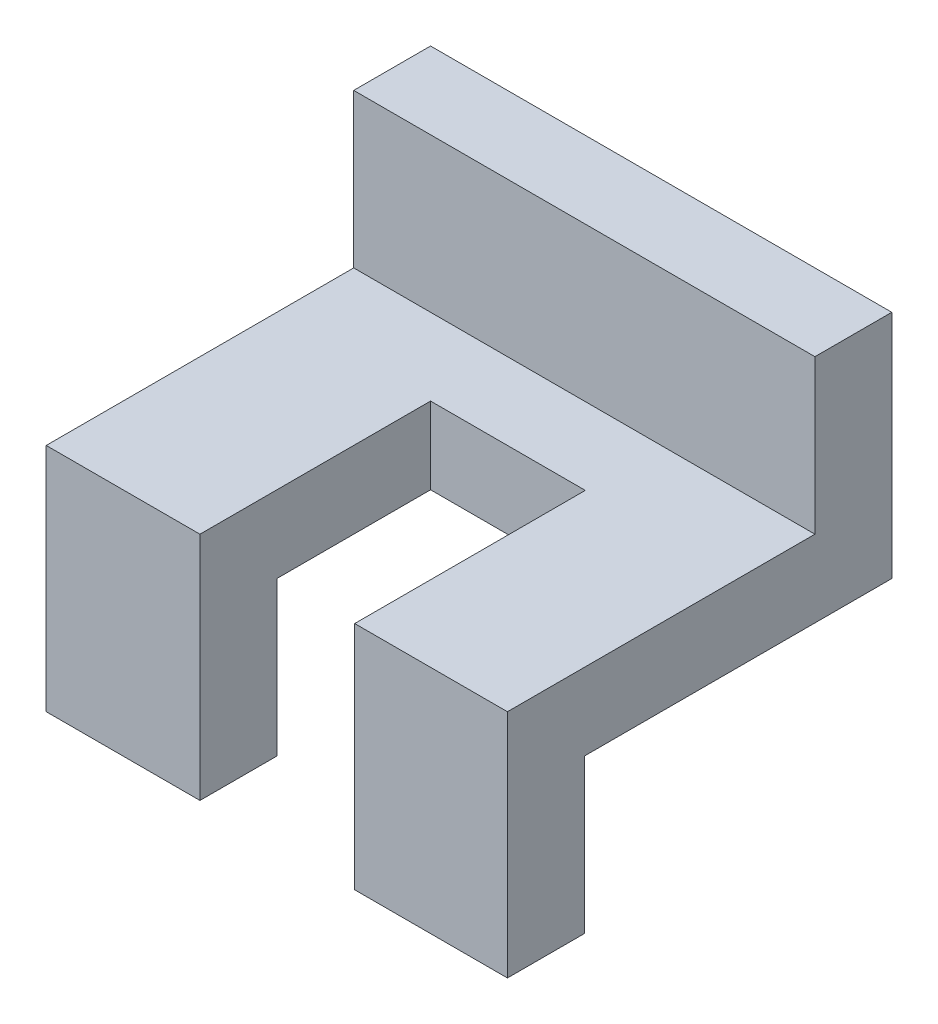
ISO-10303-21;
HEADER;
FILE_DESCRIPTION(('STEP AP214'),'2;1');
FILE_NAME('part.step','',(''),(''),'','','');
FILE_SCHEMA(('AUTOMOTIVE_DESIGN { 1 0 10303 214 1 1 1 1 }'));
ENDSEC;
DATA;
#1=APPLICATION_CONTEXT('core data for automotive mechanical design processes');
#2=APPLICATION_PROTOCOL_DEFINITION('international standard','automotive_design',2000,#1);
#3=PRODUCT_CONTEXT('',#1,'mechanical');
#4=PRODUCT('Part','Part','',(#3));
#5=PRODUCT_RELATED_PRODUCT_CATEGORY('part','',(#4));
#6=PRODUCT_DEFINITION_FORMATION('','',#4);
#7=PRODUCT_DEFINITION_CONTEXT('part definition',#1,'design');
#8=PRODUCT_DEFINITION('design','',#6,#7);
#9=PRODUCT_DEFINITION_SHAPE('','',#8);
#10=(LENGTH_UNIT() NAMED_UNIT(*) SI_UNIT(.MILLI.,.METRE.));
#11=(NAMED_UNIT(*) PLANE_ANGLE_UNIT() SI_UNIT($,.RADIAN.));
#12=(NAMED_UNIT(*) SI_UNIT($,.STERADIAN.) SOLID_ANGLE_UNIT());
#13=UNCERTAINTY_MEASURE_WITH_UNIT(LENGTH_MEASURE(1.E-05),#10,'distance_accuracy_value','');
#14=(GEOMETRIC_REPRESENTATION_CONTEXT(3) GLOBAL_UNCERTAINTY_ASSIGNED_CONTEXT((#13)) GLOBAL_UNIT_ASSIGNED_CONTEXT((#10,
#11,#12)) REPRESENTATION_CONTEXT('',''));
#15=CARTESIAN_POINT('',(0.,0.,0.));
#16=DIRECTION('',(0.,0.,1.));
#17=DIRECTION('',(1.,0.,0.));
#18=AXIS2_PLACEMENT_3D('',#15,#16,#17);
#19=CARTESIAN_POINT('',(38.1,3.175,15.875));
#20=DIRECTION('',(0.,0.,-1.));
#21=DIRECTION('',(0.,1.,0.));
#22=AXIS2_PLACEMENT_3D('',#19,#20,#21);
#23=PLANE('',#22);
#24=DIRECTION('',(-1.,0.,0.));
#25=VECTOR('',#24,1.);
#26=CARTESIAN_POINT('',(38.1,-15.875,15.875));
#27=LINE('',#26,#25);
#28=CARTESIAN_POINT('',(12.7,-15.875,15.875));
#29=VERTEX_POINT('',#28);
#30=CARTESIAN_POINT('',(0.,-15.875,15.875));
#31=VERTEX_POINT('',#30);
#32=EDGE_CURVE('E172',#29,#31,#27,.T.);
#33=ORIENTED_EDGE('',*,*,#32,.F.);
#34=DIRECTION('',(0.,1.,0.));
#35=VECTOR('',#34,1.);
#36=CARTESIAN_POINT('',(12.7,-15.875,15.875));
#37=LINE('',#36,#35);
#38=CARTESIAN_POINT('',(12.7,3.175,15.875));
#39=VERTEX_POINT('',#38);
#40=EDGE_CURVE('E214',#29,#39,#37,.T.);
#41=ORIENTED_EDGE('',*,*,#40,.T.);
#42=DIRECTION('',(-1.,0.,0.));
#43=VECTOR('',#42,1.);
#44=CARTESIAN_POINT('',(38.1,3.175,15.875));
#45=LINE('',#44,#43);
#46=CARTESIAN_POINT('',(0.,3.175,15.875));
#47=VERTEX_POINT('',#46);
#48=EDGE_CURVE('E176',#39,#47,#45,.T.);
#49=ORIENTED_EDGE('',*,*,#48,.T.);
#50=DIRECTION('',(0.,-1.,0.));
#51=VECTOR('',#50,1.);
#52=CARTESIAN_POINT('',(0.,3.175,15.875));
#53=LINE('',#52,#51);
#54=EDGE_CURVE('E150',#47,#31,#53,.T.);
#55=ORIENTED_EDGE('',*,*,#54,.T.);
#56=EDGE_LOOP('',(#33,#41,#49,#55));
#57=FACE_BOUND('',#56,.T.);
#58=ADVANCED_FACE('F33',(#57),#23,.F.);
#59=CARTESIAN_POINT('',(38.1,-15.875,15.875));
#60=DIRECTION('',(0.,1.,0.));
#61=DIRECTION('',(0.,0.,1.));
#62=AXIS2_PLACEMENT_3D('',#59,#60,#61);
#63=PLANE('',#62);
#64=DIRECTION('',(-1.,0.,0.));
#65=VECTOR('',#64,1.);
#66=CARTESIAN_POINT('',(38.1,-15.875,9.525));
#67=LINE('',#66,#65);
#68=CARTESIAN_POINT('',(12.7,-15.875,9.525));
#69=VERTEX_POINT('',#68);
#70=CARTESIAN_POINT('',(0.,-15.875,9.525));
#71=VERTEX_POINT('',#70);
#72=EDGE_CURVE('E168',#69,#71,#67,.T.);
#73=ORIENTED_EDGE('',*,*,#72,.F.);
#74=DIRECTION('',(0.,0.,1.));
#75=VECTOR('',#74,1.);
#76=CARTESIAN_POINT('',(12.7,-15.875,15.875));
#77=LINE('',#76,#75);
#78=EDGE_CURVE('E245',#69,#29,#77,.T.);
#79=ORIENTED_EDGE('',*,*,#78,.T.);
#80=ORIENTED_EDGE('',*,*,#32,.T.);
#81=DIRECTION('',(0.,0.,-1.));
#82=VECTOR('',#81,1.);
#83=CARTESIAN_POINT('',(0.,-15.875,15.875));
#84=LINE('',#83,#82);
#85=EDGE_CURVE('E153',#31,#71,#84,.T.);
#86=ORIENTED_EDGE('',*,*,#85,.T.);
#87=EDGE_LOOP('',(#73,#79,#80,#86));
#88=FACE_BOUND('',#87,.T.);
#89=ADVANCED_FACE('F251',(#88),#63,.F.);
#90=CARTESIAN_POINT('',(38.1,-3.175,9.525));
#91=DIRECTION('',(0.,0.,1.));
#92=DIRECTION('',(0.,-1.,0.));
#93=AXIS2_PLACEMENT_3D('',#90,#91,#92);
#94=PLANE('',#93);
#95=DIRECTION('',(-1.,0.,0.));
#96=VECTOR('',#95,1.);
#97=CARTESIAN_POINT('',(38.1,-3.175,9.525));
#98=LINE('',#97,#96);
#99=CARTESIAN_POINT('',(12.7,-3.175,9.525));
#100=VERTEX_POINT('',#99);
#101=CARTESIAN_POINT('',(0.,-3.175,9.525));
#102=VERTEX_POINT('',#101);
#103=EDGE_CURVE('E134',#100,#102,#98,.T.);
#104=ORIENTED_EDGE('',*,*,#103,.F.);
#105=DIRECTION('',(0.,-1.,0.));
#106=VECTOR('',#105,1.);
#107=CARTESIAN_POINT('',(12.7,-3.175,9.525));
#108=LINE('',#107,#106);
#109=EDGE_CURVE('E147',#100,#69,#108,.T.);
#110=ORIENTED_EDGE('',*,*,#109,.T.);
#111=ORIENTED_EDGE('',*,*,#72,.T.);
#112=DIRECTION('',(0.,1.,0.));
#113=VECTOR('',#112,1.);
#114=CARTESIAN_POINT('',(0.,-3.175,9.525));
#115=LINE('',#114,#113);
#116=EDGE_CURVE('E156',#71,#102,#115,.T.);
#117=ORIENTED_EDGE('',*,*,#116,.T.);
#118=EDGE_LOOP('',(#104,#110,#111,#117));
#119=FACE_BOUND('',#118,.T.);
#120=ADVANCED_FACE('F249',(#119),#94,.F.);
#121=CARTESIAN_POINT('',(38.1,3.175,-9.525));
#122=DIRECTION('',(0.,0.,-1.));
#123=DIRECTION('',(-1.,0.,0.));
#124=AXIS2_PLACEMENT_3D('',#121,#122,#123);
#125=PLANE('',#124);
#126=DIRECTION('',(0.,-1.,0.));
#127=VECTOR('',#126,1.);
#128=CARTESIAN_POINT('',(0.,3.175,-9.525));
#129=LINE('',#128,#127);
#130=CARTESIAN_POINT('',(0.,15.875,-9.525));
#131=VERTEX_POINT('',#130);
#132=CARTESIAN_POINT('',(0.,3.175,-9.525));
#133=VERTEX_POINT('',#132);
#134=EDGE_CURVE('E143',#131,#133,#129,.T.);
#135=ORIENTED_EDGE('',*,*,#134,.T.);
#136=DIRECTION('',(-1.,0.,0.));
#137=VECTOR('',#136,1.);
#138=CARTESIAN_POINT('',(38.1,3.175,-9.525));
#139=LINE('',#138,#137);
#140=CARTESIAN_POINT('',(38.1,3.175,-9.525));
#141=VERTEX_POINT('',#140);
#142=EDGE_CURVE('E180',#141,#133,#139,.T.);
#143=ORIENTED_EDGE('',*,*,#142,.F.);
#144=DIRECTION('',(0.,-1.,0.));
#145=VECTOR('',#144,1.);
#146=CARTESIAN_POINT('',(38.1,3.175,-9.525));
#147=LINE('',#146,#145);
#148=CARTESIAN_POINT('',(38.1,15.875,-9.525));
#149=VERTEX_POINT('',#148);
#150=EDGE_CURVE('E163',#149,#141,#147,.T.);
#151=ORIENTED_EDGE('',*,*,#150,.F.);
#152=DIRECTION('',(-1.,0.,0.));
#153=VECTOR('',#152,1.);
#154=CARTESIAN_POINT('',(38.1,15.875,-9.525));
#155=LINE('',#154,#153);
#156=EDGE_CURVE('E139',#149,#131,#155,.T.);
#157=ORIENTED_EDGE('',*,*,#156,.T.);
#158=EDGE_LOOP('',(#135,#143,#151,#157));
#159=FACE_BOUND('',#158,.T.);
#160=ADVANCED_FACE('F35',(#159),#125,.F.);
#161=CARTESIAN_POINT('',(38.1,3.175,15.875));
#162=DIRECTION('',(0.,-1.,0.));
#163=DIRECTION('',(0.,0.,-1.));
#164=AXIS2_PLACEMENT_3D('',#161,#162,#163);
#165=PLANE('',#164);
#166=ORIENTED_EDGE('',*,*,#48,.F.);
#167=DIRECTION('',(0.,0.,1.));
#168=VECTOR('',#167,1.);
#169=CARTESIAN_POINT('',(12.7,3.175,15.875));
#170=LINE('',#169,#168);
#171=CARTESIAN_POINT('',(12.7,3.175,-3.175));
#172=VERTEX_POINT('',#171);
#173=EDGE_CURVE('E279',#172,#39,#170,.T.);
#174=ORIENTED_EDGE('',*,*,#173,.F.);
#175=DIRECTION('',(-1.,0.,0.));
#176=VECTOR('',#175,1.);
#177=CARTESIAN_POINT('',(12.7,3.175,-3.175));
#178=LINE('',#177,#176);
#179=CARTESIAN_POINT('',(25.4826899387569,3.175,-3.175));
#180=VERTEX_POINT('',#179);
#181=EDGE_CURVE('E199',#180,#172,#178,.T.);
#182=ORIENTED_EDGE('',*,*,#181,.F.);
#183=DIRECTION('',(0.,0.,-1.));
#184=VECTOR('',#183,1.);
#185=CARTESIAN_POINT('',(25.4826899387569,3.175,15.875));
#186=LINE('',#185,#184);
#187=CARTESIAN_POINT('',(25.4826899387569,3.175,15.875));
#188=VERTEX_POINT('',#187);
#189=EDGE_CURVE('E268',#188,#180,#186,.T.);
#190=ORIENTED_EDGE('',*,*,#189,.F.);
#191=CARTESIAN_POINT('',(38.1,3.175,15.875));
#192=VERTEX_POINT('',#191);
#193=EDGE_CURVE('E177',#192,#188,#45,.T.);
#194=ORIENTED_EDGE('',*,*,#193,.F.);
#195=DIRECTION('',(0.,0.,1.));
#196=VECTOR('',#195,1.);
#197=CARTESIAN_POINT('',(38.1,3.175,15.875));
#198=LINE('',#197,#196);
#199=EDGE_CURVE('E99',#141,#192,#198,.T.);
#200=ORIENTED_EDGE('',*,*,#199,.F.);
#201=ORIENTED_EDGE('',*,*,#142,.T.);
#202=DIRECTION('',(0.,0.,1.));
#203=VECTOR('',#202,1.);
#204=CARTESIAN_POINT('',(0.,3.175,15.875));
#205=LINE('',#204,#203);
#206=EDGE_CURVE('E146',#133,#47,#205,.T.);
#207=ORIENTED_EDGE('',*,*,#206,.T.);
#208=EDGE_LOOP('',(#166,#174,#182,#190,#194,#200,#201,#207));
#209=FACE_BOUND('',#208,.T.);
#210=ADVANCED_FACE('F266',(#209),#165,.F.);
#211=ORIENTED_EDGE('',*,*,#193,.T.);
#212=DIRECTION('',(0.,1.,0.));
#213=VECTOR('',#212,1.);
#214=CARTESIAN_POINT('',(25.4826899387569,-15.875,15.875));
#215=LINE('',#214,#213);
#216=CARTESIAN_POINT('',(25.4826899387569,-15.875,15.875));
#217=VERTEX_POINT('',#216);
#218=EDGE_CURVE('E207',#217,#188,#215,.T.);
#219=ORIENTED_EDGE('',*,*,#218,.F.);
#220=CARTESIAN_POINT('',(38.1,-15.875,15.875));
#221=VERTEX_POINT('',#220);
#222=EDGE_CURVE('E173',#221,#217,#27,.T.);
#223=ORIENTED_EDGE('',*,*,#222,.F.);
#224=DIRECTION('',(0.,-1.,0.));
#225=VECTOR('',#224,1.);
#226=CARTESIAN_POINT('',(38.1,3.175,15.875));
#227=LINE('',#226,#225);
#228=EDGE_CURVE('E222',#192,#221,#227,.T.);
#229=ORIENTED_EDGE('',*,*,#228,.F.);
#230=EDGE_LOOP('',(#211,#219,#223,#229));
#231=FACE_BOUND('',#230,.T.);
#232=ADVANCED_FACE('F271',(#231),#23,.F.);
#233=ORIENTED_EDGE('',*,*,#222,.T.);
#234=DIRECTION('',(0.,0.,-1.));
#235=VECTOR('',#234,1.);
#236=CARTESIAN_POINT('',(25.4826899387569,-15.875,15.875));
#237=LINE('',#236,#235);
#238=CARTESIAN_POINT('',(25.4826899387569,-15.875,9.525));
#239=VERTEX_POINT('',#238);
#240=EDGE_CURVE('E216',#217,#239,#237,.T.);
#241=ORIENTED_EDGE('',*,*,#240,.T.);
#242=CARTESIAN_POINT('',(38.1,-15.875,9.525));
#243=VERTEX_POINT('',#242);
#244=EDGE_CURVE('E169',#243,#239,#67,.T.);
#245=ORIENTED_EDGE('',*,*,#244,.F.);
#246=DIRECTION('',(0.,0.,-1.));
#247=VECTOR('',#246,1.);
#248=CARTESIAN_POINT('',(38.1,-15.875,15.875));
#249=LINE('',#248,#247);
#250=EDGE_CURVE('E224',#221,#243,#249,.T.);
#251=ORIENTED_EDGE('',*,*,#250,.F.);
#252=EDGE_LOOP('',(#233,#241,#245,#251));
#253=FACE_BOUND('',#252,.T.);
#254=ADVANCED_FACE('F231',(#253),#63,.F.);
#255=ORIENTED_EDGE('',*,*,#244,.T.);
#256=DIRECTION('',(0.,1.,0.));
#257=VECTOR('',#256,1.);
#258=CARTESIAN_POINT('',(25.4826899387569,-3.175,9.525));
#259=LINE('',#258,#257);
#260=CARTESIAN_POINT('',(25.4826899387569,-3.175,9.525));
#261=VERTEX_POINT('',#260);
#262=EDGE_CURVE('E203',#239,#261,#259,.T.);
#263=ORIENTED_EDGE('',*,*,#262,.T.);
#264=CARTESIAN_POINT('',(38.1,-3.175,9.525));
#265=VERTEX_POINT('',#264);
#266=EDGE_CURVE('E166',#265,#261,#98,.T.);
#267=ORIENTED_EDGE('',*,*,#266,.F.);
#268=DIRECTION('',(0.,1.,0.));
#269=VECTOR('',#268,1.);
#270=CARTESIAN_POINT('',(38.1,-3.175,9.525));
#271=LINE('',#270,#269);
#272=EDGE_CURVE('E121',#243,#265,#271,.T.);
#273=ORIENTED_EDGE('',*,*,#272,.F.);
#274=EDGE_LOOP('',(#255,#263,#267,#273));
#275=FACE_BOUND('',#274,.T.);
#276=ADVANCED_FACE('F235',(#275),#94,.F.);
#277=CARTESIAN_POINT('',(38.1,-3.175,9.525));
#278=DIRECTION('',(0.,1.,0.));
#279=DIRECTION('',(0.,0.,1.));
#280=AXIS2_PLACEMENT_3D('',#277,#278,#279);
#281=PLANE('',#280);
#282=DIRECTION('',(-1.,0.,0.));
#283=VECTOR('',#282,1.);
#284=CARTESIAN_POINT('',(38.1,-3.175,-3.175));
#285=LINE('',#284,#283);
#286=CARTESIAN_POINT('',(25.4826899387569,-3.175,-3.175));
#287=VERTEX_POINT('',#286);
#288=CARTESIAN_POINT('',(12.7,-3.175,-3.175));
#289=VERTEX_POINT('',#288);
#290=EDGE_CURVE('E41',#287,#289,#285,.T.);
#291=ORIENTED_EDGE('',*,*,#290,.T.);
#292=DIRECTION('',(0.,0.,1.));
#293=VECTOR('',#292,1.);
#294=CARTESIAN_POINT('',(12.7,-3.175,9.525));
#295=LINE('',#294,#293);
#296=EDGE_CURVE('E11',#289,#100,#295,.T.);
#297=ORIENTED_EDGE('',*,*,#296,.T.);
#298=ORIENTED_EDGE('',*,*,#103,.T.);
#299=DIRECTION('',(0.,0.,-1.));
#300=VECTOR('',#299,1.);
#301=CARTESIAN_POINT('',(0.,-3.175,9.525));
#302=LINE('',#301,#300);
#303=CARTESIAN_POINT('',(0.,-3.175,-15.875));
#304=VERTEX_POINT('',#303);
#305=EDGE_CURVE('E131',#102,#304,#302,.T.);
#306=ORIENTED_EDGE('',*,*,#305,.T.);
#307=DIRECTION('',(-1.,0.,0.));
#308=VECTOR('',#307,1.);
#309=CARTESIAN_POINT('',(38.1,-3.175,-15.875));
#310=LINE('',#309,#308);
#311=CARTESIAN_POINT('',(38.1,-3.175,-15.875));
#312=VERTEX_POINT('',#311);
#313=EDGE_CURVE('E127',#312,#304,#310,.T.);
#314=ORIENTED_EDGE('',*,*,#313,.F.);
#315=DIRECTION('',(0.,0.,-1.));
#316=VECTOR('',#315,1.);
#317=CARTESIAN_POINT('',(38.1,-3.175,9.525));
#318=LINE('',#317,#316);
#319=EDGE_CURVE('E114',#265,#312,#318,.T.);
#320=ORIENTED_EDGE('',*,*,#319,.F.);
#321=ORIENTED_EDGE('',*,*,#266,.T.);
#322=DIRECTION('',(0.,0.,-1.));
#323=VECTOR('',#322,1.);
#324=CARTESIAN_POINT('',(25.4826899387569,-3.175,9.525));
#325=LINE('',#324,#323);
#326=EDGE_CURVE('E182',#261,#287,#325,.T.);
#327=ORIENTED_EDGE('',*,*,#326,.T.);
#328=EDGE_LOOP('',(#291,#297,#298,#306,#314,#320,#321,#327));
#329=FACE_BOUND('',#328,.T.);
#330=ADVANCED_FACE('F129',(#329),#281,.F.);
#331=CARTESIAN_POINT('',(38.1,15.875,-15.875));
#332=DIRECTION('',(0.,0.,1.));
#333=DIRECTION('',(1.,0.,0.));
#334=AXIS2_PLACEMENT_3D('',#331,#332,#333);
#335=PLANE('',#334);
#336=DIRECTION('',(0.,1.,0.));
#337=VECTOR('',#336,1.);
#338=CARTESIAN_POINT('',(0.,15.875,-15.875));
#339=LINE('',#338,#337);
#340=CARTESIAN_POINT('',(0.,15.875,-15.875));
#341=VERTEX_POINT('',#340);
#342=EDGE_CURVE('E160',#304,#341,#339,.T.);
#343=ORIENTED_EDGE('',*,*,#342,.T.);
#344=DIRECTION('',(-1.,0.,0.));
#345=VECTOR('',#344,1.);
#346=CARTESIAN_POINT('',(38.1,15.875,-15.875));
#347=LINE('',#346,#345);
#348=CARTESIAN_POINT('',(38.1,15.875,-15.875));
#349=VERTEX_POINT('',#348);
#350=EDGE_CURVE('E135',#349,#341,#347,.T.);
#351=ORIENTED_EDGE('',*,*,#350,.F.);
#352=DIRECTION('',(0.,1.,0.));
#353=VECTOR('',#352,1.);
#354=CARTESIAN_POINT('',(38.1,15.875,-15.875));
#355=LINE('',#354,#353);
#356=EDGE_CURVE('E118',#312,#349,#355,.T.);
#357=ORIENTED_EDGE('',*,*,#356,.F.);
#358=ORIENTED_EDGE('',*,*,#313,.T.);
#359=EDGE_LOOP('',(#343,#351,#357,#358));
#360=FACE_BOUND('',#359,.T.);
#361=ADVANCED_FACE('F137',(#360),#335,.F.);
#362=CARTESIAN_POINT('',(38.1,15.875,-15.875));
#363=DIRECTION('',(0.,-1.,0.));
#364=DIRECTION('',(0.,0.,-1.));
#365=AXIS2_PLACEMENT_3D('',#362,#363,#364);
#366=PLANE('',#365);
#367=DIRECTION('',(0.,0.,1.));
#368=VECTOR('',#367,1.);
#369=CARTESIAN_POINT('',(0.,15.875,-15.875));
#370=LINE('',#369,#368);
#371=EDGE_CURVE('E90',#341,#131,#370,.T.);
#372=ORIENTED_EDGE('',*,*,#371,.T.);
#373=ORIENTED_EDGE('',*,*,#156,.F.);
#374=DIRECTION('',(0.,0.,1.));
#375=VECTOR('',#374,1.);
#376=CARTESIAN_POINT('',(38.1,15.875,-15.875));
#377=LINE('',#376,#375);
#378=EDGE_CURVE('E57',#349,#149,#377,.T.);
#379=ORIENTED_EDGE('',*,*,#378,.F.);
#380=ORIENTED_EDGE('',*,*,#350,.T.);
#381=EDGE_LOOP('',(#372,#373,#379,#380));
#382=FACE_BOUND('',#381,.T.);
#383=ADVANCED_FACE('F260',(#382),#366,.F.);
#384=CARTESIAN_POINT('',(38.1,0.,0.));
#385=DIRECTION('',(1.,0.,0.));
#386=DIRECTION('',(0.,0.,-1.));
#387=AXIS2_PLACEMENT_3D('',#384,#385,#386);
#388=PLANE('',#387);
#389=ORIENTED_EDGE('',*,*,#150,.T.);
#390=ORIENTED_EDGE('',*,*,#199,.T.);
#391=ORIENTED_EDGE('',*,*,#228,.T.);
#392=ORIENTED_EDGE('',*,*,#250,.T.);
#393=ORIENTED_EDGE('',*,*,#272,.T.);
#394=ORIENTED_EDGE('',*,*,#319,.T.);
#395=ORIENTED_EDGE('',*,*,#356,.T.);
#396=ORIENTED_EDGE('',*,*,#378,.T.);
#397=EDGE_LOOP('',(#389,#390,#391,#392,#393,#394,#395,#396));
#398=FACE_BOUND('',#397,.T.);
#399=ADVANCED_FACE('F116',(#398),#388,.T.);
#400=CARTESIAN_POINT('',(0.,0.,0.));
#401=DIRECTION('',(1.,0.,0.));
#402=DIRECTION('',(0.,0.,-1.));
#403=AXIS2_PLACEMENT_3D('',#400,#401,#402);
#404=PLANE('',#403);
#405=ORIENTED_EDGE('',*,*,#134,.F.);
#406=ORIENTED_EDGE('',*,*,#371,.F.);
#407=ORIENTED_EDGE('',*,*,#342,.F.);
#408=ORIENTED_EDGE('',*,*,#305,.F.);
#409=ORIENTED_EDGE('',*,*,#116,.F.);
#410=ORIENTED_EDGE('',*,*,#85,.F.);
#411=ORIENTED_EDGE('',*,*,#54,.F.);
#412=ORIENTED_EDGE('',*,*,#206,.F.);
#413=EDGE_LOOP('',(#405,#406,#407,#408,#409,#410,#411,#412));
#414=FACE_BOUND('',#413,.T.);
#415=ADVANCED_FACE('F259',(#414),#404,.F.);
#416=CARTESIAN_POINT('',(12.7,-15.875,15.875));
#417=DIRECTION('',(-1.,0.,0.));
#418=DIRECTION('',(0.,0.,1.));
#419=AXIS2_PLACEMENT_3D('',#416,#417,#418);
#420=PLANE('',#419);
#421=ORIENTED_EDGE('',*,*,#296,.F.);
#422=DIRECTION('',(0.,1.,0.));
#423=VECTOR('',#422,1.);
#424=CARTESIAN_POINT('',(12.7,-15.875,-3.175));
#425=LINE('',#424,#423);
#426=EDGE_CURVE('E196',#289,#172,#425,.T.);
#427=ORIENTED_EDGE('',*,*,#426,.T.);
#428=ORIENTED_EDGE('',*,*,#173,.T.);
#429=ORIENTED_EDGE('',*,*,#40,.F.);
#430=ORIENTED_EDGE('',*,*,#78,.F.);
#431=ORIENTED_EDGE('',*,*,#109,.F.);
#432=EDGE_LOOP('',(#421,#427,#428,#429,#430,#431));
#433=FACE_BOUND('',#432,.T.);
#434=ADVANCED_FACE('F246',(#433),#420,.F.);
#435=CARTESIAN_POINT('',(12.7,-15.875,-3.175));
#436=DIRECTION('',(0.,0.,-1.));
#437=DIRECTION('',(0.,1.,0.));
#438=AXIS2_PLACEMENT_3D('',#435,#436,#437);
#439=PLANE('',#438);
#440=DIRECTION('',(0.,1.,0.));
#441=VECTOR('',#440,1.);
#442=CARTESIAN_POINT('',(25.4826899387569,-15.875,-3.175));
#443=LINE('',#442,#441);
#444=EDGE_CURVE('E48',#287,#180,#443,.T.);
#445=ORIENTED_EDGE('',*,*,#444,.T.);
#446=ORIENTED_EDGE('',*,*,#181,.T.);
#447=ORIENTED_EDGE('',*,*,#426,.F.);
#448=ORIENTED_EDGE('',*,*,#290,.F.);
#449=EDGE_LOOP('',(#445,#446,#447,#448));
#450=FACE_BOUND('',#449,.T.);
#451=ADVANCED_FACE('F192',(#450),#439,.F.);
#452=CARTESIAN_POINT('',(25.4826899387569,-15.875,15.875));
#453=DIRECTION('',(1.,0.,0.));
#454=DIRECTION('',(0.,0.,-1.));
#455=AXIS2_PLACEMENT_3D('',#452,#453,#454);
#456=PLANE('',#455);
#457=ORIENTED_EDGE('',*,*,#240,.F.);
#458=ORIENTED_EDGE('',*,*,#218,.T.);
#459=ORIENTED_EDGE('',*,*,#189,.T.);
#460=ORIENTED_EDGE('',*,*,#444,.F.);
#461=ORIENTED_EDGE('',*,*,#326,.F.);
#462=ORIENTED_EDGE('',*,*,#262,.F.);
#463=EDGE_LOOP('',(#457,#458,#459,#460,#461,#462));
#464=FACE_BOUND('',#463,.T.);
#465=ADVANCED_FACE('F278',(#464),#456,.F.);
#466=CLOSED_SHELL('',(#58,#89,#120,#160,#210,#232,#254,#276,#330,#361,#383,#399,#415,#434,#451,#465));
#467=MANIFOLD_SOLID_BREP('B2',#466);
#468=ADVANCED_BREP_SHAPE_REPRESENTATION('',(#18,#467),#14);
#469=SHAPE_DEFINITION_REPRESENTATION(#9,#468);
ENDSEC;
END-ISO-10303-21;
